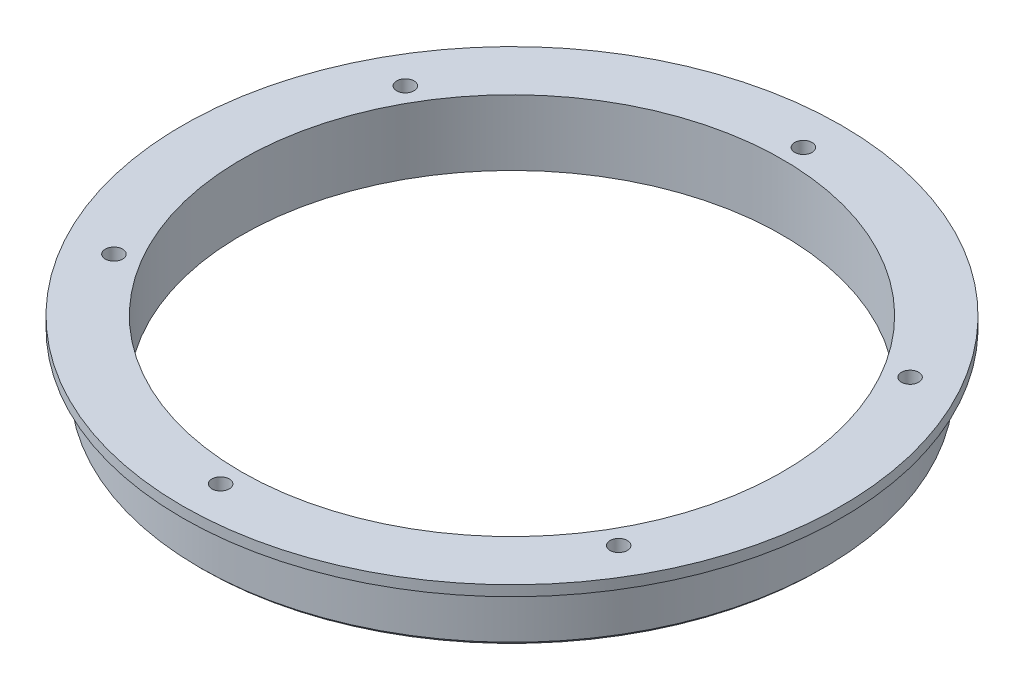
ISO-10303-21;
HEADER;
FILE_DESCRIPTION(('STEP AP214'),'2;1');
FILE_NAME('part.step','',(''),(''),'','','');
FILE_SCHEMA(('AUTOMOTIVE_DESIGN { 1 0 10303 214 1 1 1 1 }'));
ENDSEC;
DATA;
#1=APPLICATION_CONTEXT('core data for automotive mechanical design processes');
#2=APPLICATION_PROTOCOL_DEFINITION('international standard','automotive_design',2000,#1);
#3=PRODUCT_CONTEXT('',#1,'mechanical');
#4=PRODUCT('Part','Part','',(#3));
#5=PRODUCT_RELATED_PRODUCT_CATEGORY('part','',(#4));
#6=PRODUCT_DEFINITION_FORMATION('','',#4);
#7=PRODUCT_DEFINITION_CONTEXT('part definition',#1,'design');
#8=PRODUCT_DEFINITION('design','',#6,#7);
#9=PRODUCT_DEFINITION_SHAPE('','',#8);
#10=(LENGTH_UNIT() NAMED_UNIT(*) SI_UNIT(.MILLI.,.METRE.));
#11=(NAMED_UNIT(*) PLANE_ANGLE_UNIT() SI_UNIT($,.RADIAN.));
#12=(NAMED_UNIT(*) SI_UNIT($,.STERADIAN.) SOLID_ANGLE_UNIT());
#13=UNCERTAINTY_MEASURE_WITH_UNIT(LENGTH_MEASURE(1.E-05),#10,'distance_accuracy_value','');
#14=(GEOMETRIC_REPRESENTATION_CONTEXT(3) GLOBAL_UNCERTAINTY_ASSIGNED_CONTEXT((#13)) GLOBAL_UNIT_ASSIGNED_CONTEXT((#10,
#11,#12)) REPRESENTATION_CONTEXT('',''));
#15=CARTESIAN_POINT('',(0.,0.,0.));
#16=DIRECTION('',(0.,0.,1.));
#17=DIRECTION('',(1.,0.,0.));
#18=AXIS2_PLACEMENT_3D('',#15,#16,#17);
#19=CARTESIAN_POINT('',(0.,-3.975,0.));
#20=DIRECTION('',(0.,1.,0.));
#21=DIRECTION('',(0.,0.,1.));
#22=AXIS2_PLACEMENT_3D('',#19,#20,#21);
#23=PLANE('',#22);
#24=CARTESIAN_POINT('',(0.,-3.975,0.));
#25=DIRECTION('',(0.,1.,0.));
#26=DIRECTION('',(0.,0.,1.));
#27=AXIS2_PLACEMENT_3D('',#24,#25,#26);
#28=CIRCLE('',#27,44.5);
#29=CARTESIAN_POINT('',(0.,-3.975,44.5));
#30=VERTEX_POINT('',#29);
#31=EDGE_CURVE('E10',#30,#30,#28,.F.);
#32=ORIENTED_EDGE('',*,*,#31,.T.);
#33=EDGE_LOOP('',(#32));
#34=FACE_BOUND('',#33,.T.);
#35=CARTESIAN_POINT('',(36.3730669589466,-3.975,20.9999999999997));
#36=DIRECTION('',(0.,-1.,0.));
#37=DIRECTION('',(0.,0.,-1.));
#38=AXIS2_PLACEMENT_3D('',#35,#36,#37);
#39=CIRCLE('',#38,1.525);
#40=CARTESIAN_POINT('',(36.3730669589466,-3.975,19.4749999999997));
#41=VERTEX_POINT('',#40);
#42=EDGE_CURVE('E110',#41,#41,#39,.T.);
#43=ORIENTED_EDGE('',*,*,#42,.F.);
#44=EDGE_LOOP('',(#43));
#45=FACE_BOUND('',#44,.T.);
#46=CARTESIAN_POINT('',(0.,-3.975,42.));
#47=DIRECTION('',(0.,-1.,0.));
#48=DIRECTION('',(0.,0.,-1.));
#49=AXIS2_PLACEMENT_3D('',#46,#47,#48);
#50=CIRCLE('',#49,1.525);
#51=CARTESIAN_POINT('',(0.,-3.975,40.475));
#52=VERTEX_POINT('',#51);
#53=EDGE_CURVE('E101',#52,#52,#50,.T.);
#54=ORIENTED_EDGE('',*,*,#53,.F.);
#55=EDGE_LOOP('',(#54));
#56=FACE_BOUND('',#55,.T.);
#57=CARTESIAN_POINT('',(-36.3730669589463,-3.975,21.0000000000002));
#58=DIRECTION('',(0.,-1.,0.));
#59=DIRECTION('',(0.,0.,-1.));
#60=AXIS2_PLACEMENT_3D('',#57,#58,#59);
#61=CIRCLE('',#60,1.525);
#62=CARTESIAN_POINT('',(-36.3730669589463,-3.975,19.4750000000002));
#63=VERTEX_POINT('',#62);
#64=EDGE_CURVE('E92',#63,#63,#61,.T.);
#65=ORIENTED_EDGE('',*,*,#64,.F.);
#66=EDGE_LOOP('',(#65));
#67=FACE_BOUND('',#66,.T.);
#68=CARTESIAN_POINT('',(-36.3730669589465,-3.975,-20.9999999999999));
#69=DIRECTION('',(0.,-1.,0.));
#70=DIRECTION('',(0.,0.,-1.));
#71=AXIS2_PLACEMENT_3D('',#68,#69,#70);
#72=CIRCLE('',#71,1.525);
#73=CARTESIAN_POINT('',(-36.3730669589465,-3.975,-22.5249999999999));
#74=VERTEX_POINT('',#73);
#75=EDGE_CURVE('E83',#74,#74,#72,.T.);
#76=ORIENTED_EDGE('',*,*,#75,.F.);
#77=EDGE_LOOP('',(#76));
#78=FACE_BOUND('',#77,.T.);
#79=CARTESIAN_POINT('',(0.,-3.975,-42.));
#80=DIRECTION('',(0.,-1.,0.));
#81=DIRECTION('',(0.,0.,-1.));
#82=AXIS2_PLACEMENT_3D('',#79,#80,#81);
#83=CIRCLE('',#82,1.525);
#84=CARTESIAN_POINT('',(0.,-3.975,-43.525));
#85=VERTEX_POINT('',#84);
#86=EDGE_CURVE('E74',#85,#85,#83,.T.);
#87=ORIENTED_EDGE('',*,*,#86,.F.);
#88=EDGE_LOOP('',(#87));
#89=FACE_BOUND('',#88,.T.);
#90=CARTESIAN_POINT('',(0.,-3.975,0.));
#91=DIRECTION('',(0.,1.,0.));
#92=DIRECTION('',(0.,0.,1.));
#93=AXIS2_PLACEMENT_3D('',#90,#91,#92);
#94=CIRCLE('',#93,39.);
#95=CARTESIAN_POINT('',(0.,-3.975,39.));
#96=VERTEX_POINT('',#95);
#97=EDGE_CURVE('E54',#96,#96,#94,.T.);
#98=ORIENTED_EDGE('',*,*,#97,.T.);
#99=EDGE_LOOP('',(#98));
#100=FACE_BOUND('',#99,.T.);
#101=CARTESIAN_POINT('',(36.3730669589462,-3.975,-21.0000000000004));
#102=DIRECTION('',(0.,-1.,0.));
#103=DIRECTION('',(0.,0.,-1.));
#104=AXIS2_PLACEMENT_3D('',#101,#102,#103);
#105=CIRCLE('',#104,1.525);
#106=CARTESIAN_POINT('',(36.3730669589462,-3.975,-22.5250000000004));
#107=VERTEX_POINT('',#106);
#108=EDGE_CURVE('E119',#107,#107,#105,.T.);
#109=ORIENTED_EDGE('',*,*,#108,.F.);
#110=EDGE_LOOP('',(#109));
#111=FACE_BOUND('',#110,.T.);
#112=ADVANCED_FACE('F38',(#34,#45,#56,#67,#78,#89,#100,#111),#23,.F.);
#113=CARTESIAN_POINT('',(0.,5.475,0.));
#114=DIRECTION('',(0.,1.,0.));
#115=DIRECTION('',(0.,0.,1.));
#116=AXIS2_PLACEMENT_3D('',#113,#114,#115);
#117=PLANE('',#116);
#118=CARTESIAN_POINT('',(36.3730669589462,5.475,-21.0000000000004));
#119=DIRECTION('',(0.,-1.,0.));
#120=DIRECTION('',(0.,0.,-1.));
#121=AXIS2_PLACEMENT_3D('',#118,#119,#120);
#122=CIRCLE('',#121,1.24999999999999);
#123=CARTESIAN_POINT('',(36.3730669589462,5.475,-22.2500000000004));
#124=VERTEX_POINT('',#123);
#125=EDGE_CURVE('E113',#124,#124,#122,.T.);
#126=ORIENTED_EDGE('',*,*,#125,.T.);
#127=EDGE_LOOP('',(#126));
#128=FACE_BOUND('',#127,.T.);
#129=CARTESIAN_POINT('',(36.3730669589466,5.475,20.9999999999997));
#130=DIRECTION('',(0.,-1.,0.));
#131=DIRECTION('',(0.,0.,-1.));
#132=AXIS2_PLACEMENT_3D('',#129,#130,#131);
#133=CIRCLE('',#132,1.24999999999999);
#134=CARTESIAN_POINT('',(36.3730669589466,5.475,19.7499999999997));
#135=VERTEX_POINT('',#134);
#136=EDGE_CURVE('E104',#135,#135,#133,.T.);
#137=ORIENTED_EDGE('',*,*,#136,.T.);
#138=EDGE_LOOP('',(#137));
#139=FACE_BOUND('',#138,.T.);
#140=CARTESIAN_POINT('',(0.,5.475,42.));
#141=DIRECTION('',(0.,-1.,0.));
#142=DIRECTION('',(0.,0.,-1.));
#143=AXIS2_PLACEMENT_3D('',#140,#141,#142);
#144=CIRCLE('',#143,1.25);
#145=CARTESIAN_POINT('',(0.,5.475,40.75));
#146=VERTEX_POINT('',#145);
#147=EDGE_CURVE('E95',#146,#146,#144,.T.);
#148=ORIENTED_EDGE('',*,*,#147,.T.);
#149=EDGE_LOOP('',(#148));
#150=FACE_BOUND('',#149,.T.);
#151=CARTESIAN_POINT('',(-36.3730669589463,5.475,21.0000000000002));
#152=DIRECTION('',(0.,-1.,0.));
#153=DIRECTION('',(0.,0.,-1.));
#154=AXIS2_PLACEMENT_3D('',#151,#152,#153);
#155=CIRCLE('',#154,1.24999999999999);
#156=CARTESIAN_POINT('',(-36.3730669589463,5.475,19.7500000000002));
#157=VERTEX_POINT('',#156);
#158=EDGE_CURVE('E86',#157,#157,#155,.T.);
#159=ORIENTED_EDGE('',*,*,#158,.T.);
#160=EDGE_LOOP('',(#159));
#161=FACE_BOUND('',#160,.T.);
#162=CARTESIAN_POINT('',(0.,5.475,0.));
#163=DIRECTION('',(0.,1.,0.));
#164=DIRECTION('',(0.,0.,1.));
#165=AXIS2_PLACEMENT_3D('',#162,#163,#164);
#166=CIRCLE('',#165,39.);
#167=CARTESIAN_POINT('',(0.,5.475,39.));
#168=VERTEX_POINT('',#167);
#169=EDGE_CURVE('E63',#168,#168,#166,.T.);
#170=ORIENTED_EDGE('',*,*,#169,.F.);
#171=EDGE_LOOP('',(#170));
#172=FACE_BOUND('',#171,.T.);
#173=CARTESIAN_POINT('',(0.,5.475,0.));
#174=DIRECTION('',(0.,1.,0.));
#175=DIRECTION('',(0.,0.,1.));
#176=AXIS2_PLACEMENT_3D('',#173,#174,#175);
#177=CIRCLE('',#176,47.5);
#178=CARTESIAN_POINT('',(0.,5.475,47.5));
#179=VERTEX_POINT('',#178);
#180=EDGE_CURVE('E59',#179,#179,#177,.T.);
#181=ORIENTED_EDGE('',*,*,#180,.T.);
#182=EDGE_LOOP('',(#181));
#183=FACE_BOUND('',#182,.T.);
#184=CARTESIAN_POINT('',(0.,5.475,-42.));
#185=DIRECTION('',(0.,-1.,0.));
#186=DIRECTION('',(0.,0.,-1.));
#187=AXIS2_PLACEMENT_3D('',#184,#185,#186);
#188=CIRCLE('',#187,1.25);
#189=CARTESIAN_POINT('',(0.,5.475,-43.25));
#190=VERTEX_POINT('',#189);
#191=EDGE_CURVE('E68',#190,#190,#188,.T.);
#192=ORIENTED_EDGE('',*,*,#191,.T.);
#193=EDGE_LOOP('',(#192));
#194=FACE_BOUND('',#193,.T.);
#195=CARTESIAN_POINT('',(-36.3730669589465,5.475,-20.9999999999999));
#196=DIRECTION('',(0.,-1.,0.));
#197=DIRECTION('',(0.,0.,-1.));
#198=AXIS2_PLACEMENT_3D('',#195,#196,#197);
#199=CIRCLE('',#198,1.24999999999999);
#200=CARTESIAN_POINT('',(-36.3730669589465,5.475,-22.2499999999999));
#201=VERTEX_POINT('',#200);
#202=EDGE_CURVE('E77',#201,#201,#199,.T.);
#203=ORIENTED_EDGE('',*,*,#202,.T.);
#204=EDGE_LOOP('',(#203));
#205=FACE_BOUND('',#204,.T.);
#206=ADVANCED_FACE('F126',(#128,#139,#150,#161,#172,#183,#194,#205),#117,.T.);
#207=CARTESIAN_POINT('',(0.,3.975,0.));
#208=DIRECTION('',(0.,-1.,0.));
#209=DIRECTION('',(0.,0.,-1.));
#210=AXIS2_PLACEMENT_3D('',#207,#208,#209);
#211=CYLINDRICAL_SURFACE('',#210,45.);
#212=CARTESIAN_POINT('',(0.,-3.47499999999997,0.));
#213=DIRECTION('',(0.,1.,0.));
#214=DIRECTION('',(0.,0.,1.));
#215=AXIS2_PLACEMENT_3D('',#212,#213,#214);
#216=CIRCLE('',#215,45.);
#217=CARTESIAN_POINT('',(0.,-3.47499999999997,45.));
#218=VERTEX_POINT('',#217);
#219=EDGE_CURVE('E46',#218,#218,#216,.T.);
#220=ORIENTED_EDGE('',*,*,#219,.T.);
#221=EDGE_LOOP('',(#220));
#222=FACE_BOUND('',#221,.T.);
#223=CARTESIAN_POINT('',(0.,3.975,0.));
#224=DIRECTION('',(0.,1.,0.));
#225=DIRECTION('',(0.,0.,1.));
#226=AXIS2_PLACEMENT_3D('',#223,#224,#225);
#227=CIRCLE('',#226,45.);
#228=CARTESIAN_POINT('',(0.,3.975,45.));
#229=VERTEX_POINT('',#228);
#230=EDGE_CURVE('E50',#229,#229,#227,.T.);
#231=ORIENTED_EDGE('',*,*,#230,.F.);
#232=EDGE_LOOP('',(#231));
#233=FACE_BOUND('',#232,.T.);
#234=ADVANCED_FACE('F131',(#222,#233),#211,.T.);
#235=CARTESIAN_POINT('',(0.,3.975,0.));
#236=DIRECTION('',(0.,-1.,0.));
#237=DIRECTION('',(0.,0.,-1.));
#238=AXIS2_PLACEMENT_3D('',#235,#236,#237);
#239=CYLINDRICAL_SURFACE('',#238,39.);
#240=ORIENTED_EDGE('',*,*,#97,.F.);
#241=EDGE_LOOP('',(#240));
#242=FACE_BOUND('',#241,.T.);
#243=ORIENTED_EDGE('',*,*,#169,.T.);
#244=EDGE_LOOP('',(#243));
#245=FACE_BOUND('',#244,.T.);
#246=ADVANCED_FACE('F136',(#242,#245),#239,.F.);
#247=CARTESIAN_POINT('',(0.,3.975,0.));
#248=DIRECTION('',(0.,1.,0.));
#249=DIRECTION('',(0.,0.,1.));
#250=AXIS2_PLACEMENT_3D('',#247,#248,#249);
#251=PLANE('',#250);
#252=ORIENTED_EDGE('',*,*,#230,.T.);
#253=EDGE_LOOP('',(#252));
#254=FACE_BOUND('',#253,.T.);
#255=CARTESIAN_POINT('',(0.,3.975,0.));
#256=DIRECTION('',(0.,1.,0.));
#257=DIRECTION('',(0.,0.,1.));
#258=AXIS2_PLACEMENT_3D('',#255,#256,#257);
#259=CIRCLE('',#258,47.5);
#260=CARTESIAN_POINT('',(0.,3.975,47.5));
#261=VERTEX_POINT('',#260);
#262=EDGE_CURVE('E60',#261,#261,#259,.T.);
#263=ORIENTED_EDGE('',*,*,#262,.F.);
#264=EDGE_LOOP('',(#263));
#265=FACE_BOUND('',#264,.T.);
#266=ADVANCED_FACE('F142',(#254,#265),#251,.F.);
#267=CARTESIAN_POINT('',(0.,5.475,0.));
#268=DIRECTION('',(0.,-1.,0.));
#269=DIRECTION('',(0.,0.,-1.));
#270=AXIS2_PLACEMENT_3D('',#267,#268,#269);
#271=CYLINDRICAL_SURFACE('',#270,47.5);
#272=ORIENTED_EDGE('',*,*,#180,.F.);
#273=EDGE_LOOP('',(#272));
#274=FACE_BOUND('',#273,.T.);
#275=ORIENTED_EDGE('',*,*,#262,.T.);
#276=EDGE_LOOP('',(#275));
#277=FACE_BOUND('',#276,.T.);
#278=ADVANCED_FACE('F149',(#274,#277),#271,.T.);
#279=CARTESIAN_POINT('',(0.,-3.975,-42.));
#280=DIRECTION('',(0.,-1.,0.));
#281=DIRECTION('',(0.,0.,-1.));
#282=AXIS2_PLACEMENT_3D('',#279,#280,#281);
#283=CYLINDRICAL_SURFACE('',#282,1.24999999999999);
#284=ORIENTED_EDGE('',*,*,#191,.F.);
#285=EDGE_LOOP('',(#284));
#286=FACE_BOUND('',#285,.T.);
#287=CARTESIAN_POINT('',(0.,-3.69999999999999,-42.));
#288=DIRECTION('',(0.,-1.,0.));
#289=DIRECTION('',(0.,0.,-1.));
#290=AXIS2_PLACEMENT_3D('',#287,#288,#289);
#291=CIRCLE('',#290,1.24999999999999);
#292=CARTESIAN_POINT('',(0.,-3.69999999999999,-43.25));
#293=VERTEX_POINT('',#292);
#294=EDGE_CURVE('E71',#293,#293,#291,.T.);
#295=ORIENTED_EDGE('',*,*,#294,.T.);
#296=EDGE_LOOP('',(#295));
#297=FACE_BOUND('',#296,.T.);
#298=ADVANCED_FACE('F154',(#286,#297),#283,.F.);
#299=CARTESIAN_POINT('',(0.,-3.975,-42.));
#300=DIRECTION('',(0.,-1.,0.));
#301=DIRECTION('',(0.,0.,-1.));
#302=AXIS2_PLACEMENT_3D('',#299,#300,#301);
#303=CONICAL_SURFACE('',#302,1.525,0.785398163397448);
#304=ORIENTED_EDGE('',*,*,#294,.F.);
#305=EDGE_LOOP('',(#304));
#306=FACE_BOUND('',#305,.T.);
#307=ORIENTED_EDGE('',*,*,#86,.T.);
#308=EDGE_LOOP('',(#307));
#309=FACE_BOUND('',#308,.T.);
#310=ADVANCED_FACE('F159',(#306,#309),#303,.F.);
#311=CARTESIAN_POINT('',(-36.3730669589465,-3.975,-20.9999999999999));
#312=DIRECTION('',(0.,-1.,0.));
#313=DIRECTION('',(0.,0.,-1.));
#314=AXIS2_PLACEMENT_3D('',#311,#312,#313);
#315=CYLINDRICAL_SURFACE('',#314,1.24999999999999);
#316=ORIENTED_EDGE('',*,*,#202,.F.);
#317=EDGE_LOOP('',(#316));
#318=FACE_BOUND('',#317,.T.);
#319=CARTESIAN_POINT('',(-36.3730669589465,-3.69999999999999,-20.9999999999999));
#320=DIRECTION('',(0.,-1.,0.));
#321=DIRECTION('',(0.,0.,-1.));
#322=AXIS2_PLACEMENT_3D('',#319,#320,#321);
#323=CIRCLE('',#322,1.24999999999999);
#324=CARTESIAN_POINT('',(-36.3730669589465,-3.69999999999999,-22.2499999999999));
#325=VERTEX_POINT('',#324);
#326=EDGE_CURVE('E80',#325,#325,#323,.T.);
#327=ORIENTED_EDGE('',*,*,#326,.T.);
#328=EDGE_LOOP('',(#327));
#329=FACE_BOUND('',#328,.T.);
#330=ADVANCED_FACE('F166',(#318,#329),#315,.F.);
#331=CARTESIAN_POINT('',(-36.3730669589465,-3.975,-20.9999999999999));
#332=DIRECTION('',(0.,-1.,0.));
#333=DIRECTION('',(0.,0.,-1.));
#334=AXIS2_PLACEMENT_3D('',#331,#332,#333);
#335=CONICAL_SURFACE('',#334,1.525,0.785398163397445);
#336=ORIENTED_EDGE('',*,*,#326,.F.);
#337=EDGE_LOOP('',(#336));
#338=FACE_BOUND('',#337,.T.);
#339=ORIENTED_EDGE('',*,*,#75,.T.);
#340=EDGE_LOOP('',(#339));
#341=FACE_BOUND('',#340,.T.);
#342=ADVANCED_FACE('F170',(#338,#341),#335,.F.);
#343=CARTESIAN_POINT('',(-36.3730669589463,-3.975,21.0000000000002));
#344=DIRECTION('',(0.,-1.,0.));
#345=DIRECTION('',(0.,0.,-1.));
#346=AXIS2_PLACEMENT_3D('',#343,#344,#345);
#347=CYLINDRICAL_SURFACE('',#346,1.24999999999999);
#348=ORIENTED_EDGE('',*,*,#158,.F.);
#349=EDGE_LOOP('',(#348));
#350=FACE_BOUND('',#349,.T.);
#351=CARTESIAN_POINT('',(-36.3730669589463,-3.69999999999999,21.0000000000002));
#352=DIRECTION('',(0.,-1.,0.));
#353=DIRECTION('',(0.,0.,-1.));
#354=AXIS2_PLACEMENT_3D('',#351,#352,#353);
#355=CIRCLE('',#354,1.24999999999999);
#356=CARTESIAN_POINT('',(-36.3730669589463,-3.69999999999999,19.7500000000002));
#357=VERTEX_POINT('',#356);
#358=EDGE_CURVE('E89',#357,#357,#355,.T.);
#359=ORIENTED_EDGE('',*,*,#358,.T.);
#360=EDGE_LOOP('',(#359));
#361=FACE_BOUND('',#360,.T.);
#362=ADVANCED_FACE('F174',(#350,#361),#347,.F.);
#363=CARTESIAN_POINT('',(-36.3730669589463,-3.975,21.0000000000002));
#364=DIRECTION('',(0.,-1.,0.));
#365=DIRECTION('',(0.,0.,-1.));
#366=AXIS2_PLACEMENT_3D('',#363,#364,#365);
#367=CONICAL_SURFACE('',#366,1.525,0.785398163397445);
#368=ORIENTED_EDGE('',*,*,#358,.F.);
#369=EDGE_LOOP('',(#368));
#370=FACE_BOUND('',#369,.T.);
#371=ORIENTED_EDGE('',*,*,#64,.T.);
#372=EDGE_LOOP('',(#371));
#373=FACE_BOUND('',#372,.T.);
#374=ADVANCED_FACE('F178',(#370,#373),#367,.F.);
#375=CARTESIAN_POINT('',(0.,-3.975,42.));
#376=DIRECTION('',(0.,-1.,0.));
#377=DIRECTION('',(0.,0.,-1.));
#378=AXIS2_PLACEMENT_3D('',#375,#376,#377);
#379=CYLINDRICAL_SURFACE('',#378,1.24999999999999);
#380=ORIENTED_EDGE('',*,*,#147,.F.);
#381=EDGE_LOOP('',(#380));
#382=FACE_BOUND('',#381,.T.);
#383=CARTESIAN_POINT('',(0.,-3.69999999999999,42.));
#384=DIRECTION('',(0.,-1.,0.));
#385=DIRECTION('',(0.,0.,-1.));
#386=AXIS2_PLACEMENT_3D('',#383,#384,#385);
#387=CIRCLE('',#386,1.24999999999999);
#388=CARTESIAN_POINT('',(0.,-3.69999999999999,40.75));
#389=VERTEX_POINT('',#388);
#390=EDGE_CURVE('E98',#389,#389,#387,.T.);
#391=ORIENTED_EDGE('',*,*,#390,.T.);
#392=EDGE_LOOP('',(#391));
#393=FACE_BOUND('',#392,.T.);
#394=ADVANCED_FACE('F182',(#382,#393),#379,.F.);
#395=CARTESIAN_POINT('',(0.,-3.975,42.));
#396=DIRECTION('',(0.,-1.,0.));
#397=DIRECTION('',(0.,0.,-1.));
#398=AXIS2_PLACEMENT_3D('',#395,#396,#397);
#399=CONICAL_SURFACE('',#398,1.525,0.785398163397448);
#400=ORIENTED_EDGE('',*,*,#390,.F.);
#401=EDGE_LOOP('',(#400));
#402=FACE_BOUND('',#401,.T.);
#403=ORIENTED_EDGE('',*,*,#53,.T.);
#404=EDGE_LOOP('',(#403));
#405=FACE_BOUND('',#404,.T.);
#406=ADVANCED_FACE('F186',(#402,#405),#399,.F.);
#407=CARTESIAN_POINT('',(36.3730669589466,-3.975,20.9999999999997));
#408=DIRECTION('',(0.,-1.,0.));
#409=DIRECTION('',(0.,0.,-1.));
#410=AXIS2_PLACEMENT_3D('',#407,#408,#409);
#411=CYLINDRICAL_SURFACE('',#410,1.24999999999999);
#412=ORIENTED_EDGE('',*,*,#136,.F.);
#413=EDGE_LOOP('',(#412));
#414=FACE_BOUND('',#413,.T.);
#415=CARTESIAN_POINT('',(36.3730669589466,-3.69999999999999,20.9999999999997));
#416=DIRECTION('',(0.,-1.,0.));
#417=DIRECTION('',(0.,0.,-1.));
#418=AXIS2_PLACEMENT_3D('',#415,#416,#417);
#419=CIRCLE('',#418,1.24999999999999);
#420=CARTESIAN_POINT('',(36.3730669589466,-3.69999999999999,19.7499999999997));
#421=VERTEX_POINT('',#420);
#422=EDGE_CURVE('E107',#421,#421,#419,.T.);
#423=ORIENTED_EDGE('',*,*,#422,.T.);
#424=EDGE_LOOP('',(#423));
#425=FACE_BOUND('',#424,.T.);
#426=ADVANCED_FACE('F190',(#414,#425),#411,.F.);
#427=CARTESIAN_POINT('',(36.3730669589466,-3.975,20.9999999999997));
#428=DIRECTION('',(0.,-1.,0.));
#429=DIRECTION('',(0.,0.,-1.));
#430=AXIS2_PLACEMENT_3D('',#427,#428,#429);
#431=CONICAL_SURFACE('',#430,1.525,0.785398163397445);
#432=ORIENTED_EDGE('',*,*,#422,.F.);
#433=EDGE_LOOP('',(#432));
#434=FACE_BOUND('',#433,.T.);
#435=ORIENTED_EDGE('',*,*,#42,.T.);
#436=EDGE_LOOP('',(#435));
#437=FACE_BOUND('',#436,.T.);
#438=ADVANCED_FACE('F194',(#434,#437),#431,.F.);
#439=CARTESIAN_POINT('',(36.3730669589462,-3.975,-21.0000000000004));
#440=DIRECTION('',(0.,-1.,0.));
#441=DIRECTION('',(0.,0.,-1.));
#442=AXIS2_PLACEMENT_3D('',#439,#440,#441);
#443=CYLINDRICAL_SURFACE('',#442,1.24999999999999);
#444=ORIENTED_EDGE('',*,*,#125,.F.);
#445=EDGE_LOOP('',(#444));
#446=FACE_BOUND('',#445,.T.);
#447=CARTESIAN_POINT('',(36.3730669589462,-3.69999999999999,-21.0000000000004));
#448=DIRECTION('',(0.,-1.,0.));
#449=DIRECTION('',(0.,0.,-1.));
#450=AXIS2_PLACEMENT_3D('',#447,#448,#449);
#451=CIRCLE('',#450,1.24999999999999);
#452=CARTESIAN_POINT('',(36.3730669589462,-3.69999999999999,-22.2500000000004));
#453=VERTEX_POINT('',#452);
#454=EDGE_CURVE('E116',#453,#453,#451,.T.);
#455=ORIENTED_EDGE('',*,*,#454,.T.);
#456=EDGE_LOOP('',(#455));
#457=FACE_BOUND('',#456,.T.);
#458=ADVANCED_FACE('F198',(#446,#457),#443,.F.);
#459=CARTESIAN_POINT('',(36.3730669589462,-3.975,-21.0000000000004));
#460=DIRECTION('',(0.,-1.,0.));
#461=DIRECTION('',(0.,0.,-1.));
#462=AXIS2_PLACEMENT_3D('',#459,#460,#461);
#463=CONICAL_SURFACE('',#462,1.525,0.785398163397445);
#464=ORIENTED_EDGE('',*,*,#454,.F.);
#465=EDGE_LOOP('',(#464));
#466=FACE_BOUND('',#465,.T.);
#467=ORIENTED_EDGE('',*,*,#108,.T.);
#468=EDGE_LOOP('',(#467));
#469=FACE_BOUND('',#468,.T.);
#470=ADVANCED_FACE('F123',(#466,#469),#463,.F.);
#471=CARTESIAN_POINT('',(0.,-3.47499999999997,0.));
#472=DIRECTION('',(0.,1.,0.));
#473=DIRECTION('',(0.,0.,1.));
#474=AXIS2_PLACEMENT_3D('',#471,#472,#473);
#475=CONICAL_SURFACE('',#474,45.,0.785398163397455);
#476=ORIENTED_EDGE('',*,*,#31,.F.);
#477=EDGE_LOOP('',(#476));
#478=FACE_BOUND('',#477,.T.);
#479=ORIENTED_EDGE('',*,*,#219,.F.);
#480=EDGE_LOOP('',(#479));
#481=FACE_BOUND('',#480,.T.);
#482=ADVANCED_FACE('F41',(#478,#481),#475,.T.);
#483=CLOSED_SHELL('',(#112,#206,#234,#246,#266,#278,#298,#310,#330,#342,#362,#374,#394,#406,
#426,#438,#458,#470,#482));
#484=MANIFOLD_SOLID_BREP('B2',#483);
#485=ADVANCED_BREP_SHAPE_REPRESENTATION('',(#18,#484),#14);
#486=SHAPE_DEFINITION_REPRESENTATION(#9,#485);
ENDSEC;
END-ISO-10303-21;
